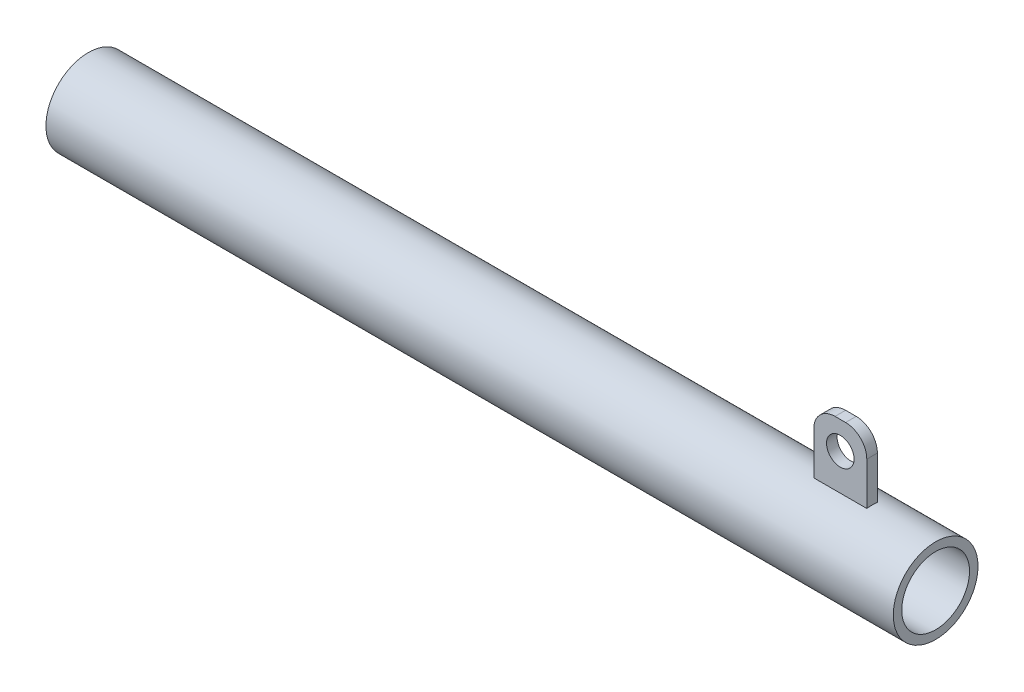
ISO-10303-21;
HEADER;
FILE_DESCRIPTION(('STEP AP214'),'2;1');
FILE_NAME('part.step','',(''),(''),'','','');
FILE_SCHEMA(('AUTOMOTIVE_DESIGN { 1 0 10303 214 1 1 1 1 }'));
ENDSEC;
DATA;
#1=APPLICATION_CONTEXT('core data for automotive mechanical design processes');
#2=APPLICATION_PROTOCOL_DEFINITION('international standard','automotive_design',2000,#1);
#3=PRODUCT_CONTEXT('',#1,'mechanical');
#4=PRODUCT('Part','Part','',(#3));
#5=PRODUCT_RELATED_PRODUCT_CATEGORY('part','',(#4));
#6=PRODUCT_DEFINITION_FORMATION('','',#4);
#7=PRODUCT_DEFINITION_CONTEXT('part definition',#1,'design');
#8=PRODUCT_DEFINITION('design','',#6,#7);
#9=PRODUCT_DEFINITION_SHAPE('','',#8);
#10=(LENGTH_UNIT() NAMED_UNIT(*) SI_UNIT(.MILLI.,.METRE.));
#11=(NAMED_UNIT(*) PLANE_ANGLE_UNIT() SI_UNIT($,.RADIAN.));
#12=(NAMED_UNIT(*) SI_UNIT($,.STERADIAN.) SOLID_ANGLE_UNIT());
#13=UNCERTAINTY_MEASURE_WITH_UNIT(LENGTH_MEASURE(1.E-05),#10,'distance_accuracy_value','');
#14=(GEOMETRIC_REPRESENTATION_CONTEXT(3) GLOBAL_UNCERTAINTY_ASSIGNED_CONTEXT((#13)) GLOBAL_UNIT_ASSIGNED_CONTEXT((#10,
#11,#12)) REPRESENTATION_CONTEXT('',''));
#15=CARTESIAN_POINT('',(0.,0.,0.));
#16=DIRECTION('',(0.,0.,1.));
#17=DIRECTION('',(1.,0.,0.));
#18=AXIS2_PLACEMENT_3D('',#15,#16,#17);
#19=CARTESIAN_POINT('',(-400.,0.,0.));
#20=DIRECTION('',(1.,0.,0.));
#21=DIRECTION('',(0.,0.,-1.));
#22=AXIS2_PLACEMENT_3D('',#19,#20,#21);
#23=CYLINDRICAL_SURFACE('',#22,20.);
#24=DIRECTION('',(1.,0.,0.));
#25=VECTOR('',#24,1.);
#26=CARTESIAN_POINT('',(-400.,19.8431348329844,-2.50000000000006));
#27=LINE('',#26,#25);
#28=CARTESIAN_POINT('',(-55.,19.8431348329844,-2.5));
#29=VERTEX_POINT('',#28);
#30=CARTESIAN_POINT('',(-30.,19.8431348329844,-2.50000000000006));
#31=VERTEX_POINT('',#30);
#32=EDGE_CURVE('E93',#29,#31,#27,.T.);
#33=ORIENTED_EDGE('',*,*,#32,.T.);
#34=CARTESIAN_POINT('',(-30.,0.,0.));
#35=DIRECTION('',(1.,0.,0.));
#36=DIRECTION('',(0.,0.,-1.));
#37=AXIS2_PLACEMENT_3D('',#34,#35,#36);
#38=CIRCLE('',#37,20.);
#39=CARTESIAN_POINT('',(-30.,19.8431348329844,2.49999999999994));
#40=VERTEX_POINT('',#39);
#41=EDGE_CURVE('E87',#31,#40,#38,.T.);
#42=ORIENTED_EDGE('',*,*,#41,.T.);
#43=DIRECTION('',(1.,0.,0.));
#44=VECTOR('',#43,1.);
#45=CARTESIAN_POINT('',(-400.,19.8431348329844,2.49999999999994));
#46=LINE('',#45,#44);
#47=CARTESIAN_POINT('',(-55.,19.8431348329844,2.49999999999994));
#48=VERTEX_POINT('',#47);
#49=EDGE_CURVE('E90',#40,#48,#46,.F.);
#50=ORIENTED_EDGE('',*,*,#49,.T.);
#51=CARTESIAN_POINT('',(-55.,0.,0.));
#52=DIRECTION('',(-1.,0.,0.));
#53=DIRECTION('',(0.,0.,1.));
#54=AXIS2_PLACEMENT_3D('',#51,#52,#53);
#55=CIRCLE('',#54,20.);
#56=EDGE_CURVE('E101',#48,#29,#55,.T.);
#57=ORIENTED_EDGE('',*,*,#56,.T.);
#58=EDGE_LOOP('',(#33,#42,#50,#57));
#59=FACE_BOUND('',#58,.T.);
#60=CARTESIAN_POINT('',(-400.,0.,0.));
#61=DIRECTION('',(1.,0.,0.));
#62=DIRECTION('',(0.,0.,-1.));
#63=AXIS2_PLACEMENT_3D('',#60,#61,#62);
#64=CIRCLE('',#63,20.);
#65=CARTESIAN_POINT('',(-400.,0.,-20.));
#66=VERTEX_POINT('',#65);
#67=EDGE_CURVE('E126',#66,#66,#64,.T.);
#68=ORIENTED_EDGE('',*,*,#67,.T.);
#69=EDGE_LOOP('',(#68));
#70=FACE_BOUND('',#69,.T.);
#71=CARTESIAN_POINT('',(0.,0.,0.));
#72=DIRECTION('',(1.,0.,0.));
#73=DIRECTION('',(0.,0.,-1.));
#74=AXIS2_PLACEMENT_3D('',#71,#72,#73);
#75=CIRCLE('',#74,20.);
#76=CARTESIAN_POINT('',(0.,0.,-20.));
#77=VERTEX_POINT('',#76);
#78=EDGE_CURVE('E123',#77,#77,#75,.T.);
#79=ORIENTED_EDGE('',*,*,#78,.F.);
#80=EDGE_LOOP('',(#79));
#81=FACE_BOUND('',#80,.T.);
#82=ADVANCED_FACE('F33',(#59,#70,#81),#23,.T.);
#83=CARTESIAN_POINT('',(-400.,0.,0.));
#84=DIRECTION('',(1.,0.,0.));
#85=DIRECTION('',(0.,0.,-1.));
#86=AXIS2_PLACEMENT_3D('',#83,#84,#85);
#87=PLANE('',#86);
#88=CARTESIAN_POINT('',(-400.,0.,0.));
#89=DIRECTION('',(1.,0.,0.));
#90=DIRECTION('',(0.,0.,-1.));
#91=AXIS2_PLACEMENT_3D('',#88,#89,#90);
#92=CIRCLE('',#91,16.);
#93=CARTESIAN_POINT('',(-400.,0.,-16.));
#94=VERTEX_POINT('',#93);
#95=EDGE_CURVE('E120',#94,#94,#92,.T.);
#96=ORIENTED_EDGE('',*,*,#95,.T.);
#97=EDGE_LOOP('',(#96));
#98=FACE_BOUND('',#97,.T.);
#99=ORIENTED_EDGE('',*,*,#67,.F.);
#100=EDGE_LOOP('',(#99));
#101=FACE_BOUND('',#100,.T.);
#102=ADVANCED_FACE('F169',(#98,#101),#87,.F.);
#103=CARTESIAN_POINT('',(0.,0.,0.));
#104=DIRECTION('',(1.,0.,0.));
#105=DIRECTION('',(0.,0.,-1.));
#106=AXIS2_PLACEMENT_3D('',#103,#104,#105);
#107=PLANE('',#106);
#108=CARTESIAN_POINT('',(0.,0.,0.));
#109=DIRECTION('',(1.,0.,0.));
#110=DIRECTION('',(0.,0.,-1.));
#111=AXIS2_PLACEMENT_3D('',#108,#109,#110);
#112=CIRCLE('',#111,16.);
#113=CARTESIAN_POINT('',(0.,0.,-16.));
#114=VERTEX_POINT('',#113);
#115=EDGE_CURVE('E118',#114,#114,#112,.T.);
#116=ORIENTED_EDGE('',*,*,#115,.F.);
#117=EDGE_LOOP('',(#116));
#118=FACE_BOUND('',#117,.T.);
#119=ORIENTED_EDGE('',*,*,#78,.T.);
#120=EDGE_LOOP('',(#119));
#121=FACE_BOUND('',#120,.T.);
#122=ADVANCED_FACE('F174',(#118,#121),#107,.T.);
#123=CARTESIAN_POINT('',(-400.,0.,0.));
#124=DIRECTION('',(1.,0.,0.));
#125=DIRECTION('',(0.,0.,-1.));
#126=AXIS2_PLACEMENT_3D('',#123,#124,#125);
#127=CYLINDRICAL_SURFACE('',#126,16.);
#128=ORIENTED_EDGE('',*,*,#95,.F.);
#129=EDGE_LOOP('',(#128));
#130=FACE_BOUND('',#129,.T.);
#131=ORIENTED_EDGE('',*,*,#115,.T.);
#132=EDGE_LOOP('',(#131));
#133=FACE_BOUND('',#132,.T.);
#134=ADVANCED_FACE('F166',(#130,#133),#127,.F.);
#135=CARTESIAN_POINT('',(-30.,-20.001,-2.5));
#136=DIRECTION('',(1.,0.,0.));
#137=DIRECTION('',(0.,0.,-1.));
#138=AXIS2_PLACEMENT_3D('',#135,#136,#137);
#139=PLANE('',#138);
#140=DIRECTION('',(0.,1.,0.));
#141=VECTOR('',#140,1.);
#142=CARTESIAN_POINT('',(-30.,-20.001,-2.5));
#143=LINE('',#142,#141);
#144=CARTESIAN_POINT('',(-30.,40.,-2.5));
#145=VERTEX_POINT('',#144);
#146=EDGE_CURVE('E113',#31,#145,#143,.T.);
#147=ORIENTED_EDGE('',*,*,#146,.T.);
#148=DIRECTION('',(0.,0.,-1.));
#149=VECTOR('',#148,1.);
#150=CARTESIAN_POINT('',(-30.,40.,-2.5));
#151=LINE('',#150,#149);
#152=CARTESIAN_POINT('',(-30.,40.,2.5));
#153=VERTEX_POINT('',#152);
#154=EDGE_CURVE('E56',#145,#153,#151,.F.);
#155=ORIENTED_EDGE('',*,*,#154,.T.);
#156=DIRECTION('',(0.,1.,0.));
#157=VECTOR('',#156,1.);
#158=CARTESIAN_POINT('',(-30.,-20.001,2.5));
#159=LINE('',#158,#157);
#160=EDGE_CURVE('E98',#40,#153,#159,.T.);
#161=ORIENTED_EDGE('',*,*,#160,.F.);
#162=ORIENTED_EDGE('',*,*,#41,.F.);
#163=EDGE_LOOP('',(#147,#155,#161,#162));
#164=FACE_BOUND('',#163,.T.);
#165=ADVANCED_FACE('F103',(#164),#139,.T.);
#166=CARTESIAN_POINT('',(-55.,-20.001,-2.5));
#167=DIRECTION('',(-1.,0.,0.));
#168=DIRECTION('',(0.,0.,1.));
#169=AXIS2_PLACEMENT_3D('',#166,#167,#168);
#170=PLANE('',#169);
#171=DIRECTION('',(0.,1.,0.));
#172=VECTOR('',#171,1.);
#173=CARTESIAN_POINT('',(-55.,-20.001,2.5));
#174=LINE('',#173,#172);
#175=CARTESIAN_POINT('',(-55.,40.,2.5));
#176=VERTEX_POINT('',#175);
#177=EDGE_CURVE('E100',#48,#176,#174,.T.);
#178=ORIENTED_EDGE('',*,*,#177,.T.);
#179=DIRECTION('',(0.,0.,1.));
#180=VECTOR('',#179,1.);
#181=CARTESIAN_POINT('',(-55.,40.,-2.5));
#182=LINE('',#181,#180);
#183=CARTESIAN_POINT('',(-55.,40.,-2.5));
#184=VERTEX_POINT('',#183);
#185=EDGE_CURVE('E11',#176,#184,#182,.F.);
#186=ORIENTED_EDGE('',*,*,#185,.T.);
#187=DIRECTION('',(0.,1.,0.));
#188=VECTOR('',#187,1.);
#189=CARTESIAN_POINT('',(-55.,-20.001,-2.5));
#190=LINE('',#189,#188);
#191=EDGE_CURVE('E105',#29,#184,#190,.T.);
#192=ORIENTED_EDGE('',*,*,#191,.F.);
#193=ORIENTED_EDGE('',*,*,#56,.F.);
#194=EDGE_LOOP('',(#178,#186,#192,#193));
#195=FACE_BOUND('',#194,.T.);
#196=ADVANCED_FACE('F157',(#195),#170,.T.);
#197=CARTESIAN_POINT('',(-55.,-20.001,-2.5));
#198=DIRECTION('',(0.,0.,-1.));
#199=DIRECTION('',(-1.,0.,0.));
#200=AXIS2_PLACEMENT_3D('',#197,#198,#199);
#201=PLANE('',#200);
#202=CARTESIAN_POINT('',(-42.5,37.,-2.5));
#203=DIRECTION('',(0.,0.,-1.));
#204=DIRECTION('',(-1.,0.,0.));
#205=AXIS2_PLACEMENT_3D('',#202,#203,#204);
#206=CIRCLE('',#205,6.5);
#207=CARTESIAN_POINT('',(-49.,37.,-2.5));
#208=VERTEX_POINT('',#207);
#209=EDGE_CURVE('E116',#208,#208,#206,.T.);
#210=ORIENTED_EDGE('',*,*,#209,.F.);
#211=EDGE_LOOP('',(#210));
#212=FACE_BOUND('',#211,.T.);
#213=DIRECTION('',(-1.,0.,0.));
#214=VECTOR('',#213,1.);
#215=CARTESIAN_POINT('',(-55.,50.,-2.5));
#216=LINE('',#215,#214);
#217=CARTESIAN_POINT('',(-40.,50.,-2.5));
#218=VERTEX_POINT('',#217);
#219=CARTESIAN_POINT('',(-45.,50.,-2.5));
#220=VERTEX_POINT('',#219);
#221=EDGE_CURVE('E104',#218,#220,#216,.T.);
#222=ORIENTED_EDGE('',*,*,#221,.F.);
#223=CARTESIAN_POINT('',(-40.,40.,-2.5));
#224=DIRECTION('',(0.,0.,-1.));
#225=DIRECTION('',(-1.,0.,0.));
#226=AXIS2_PLACEMENT_3D('',#223,#224,#225);
#227=CIRCLE('',#226,10.);
#228=EDGE_CURVE('E139',#218,#145,#227,.T.);
#229=ORIENTED_EDGE('',*,*,#228,.T.);
#230=ORIENTED_EDGE('',*,*,#146,.F.);
#231=ORIENTED_EDGE('',*,*,#32,.F.);
#232=ORIENTED_EDGE('',*,*,#191,.T.);
#233=CARTESIAN_POINT('',(-45.,40.,-2.5));
#234=DIRECTION('',(0.,0.,-1.));
#235=DIRECTION('',(-1.,0.,0.));
#236=AXIS2_PLACEMENT_3D('',#233,#234,#235);
#237=CIRCLE('',#236,10.);
#238=EDGE_CURVE('E137',#184,#220,#237,.T.);
#239=ORIENTED_EDGE('',*,*,#238,.T.);
#240=EDGE_LOOP('',(#222,#229,#230,#231,#232,#239));
#241=FACE_BOUND('',#240,.T.);
#242=ADVANCED_FACE('F151',(#212,#241),#201,.T.);
#243=CARTESIAN_POINT('',(-55.,-20.001,2.5));
#244=DIRECTION('',(0.,0.,1.));
#245=DIRECTION('',(1.,0.,0.));
#246=AXIS2_PLACEMENT_3D('',#243,#244,#245);
#247=PLANE('',#246);
#248=CARTESIAN_POINT('',(-42.5,37.,2.50000000000001));
#249=DIRECTION('',(0.,0.,1.));
#250=DIRECTION('',(1.,0.,0.));
#251=AXIS2_PLACEMENT_3D('',#248,#249,#250);
#252=CIRCLE('',#251,6.5);
#253=CARTESIAN_POINT('',(-36.,37.,2.50000000000001));
#254=VERTEX_POINT('',#253);
#255=EDGE_CURVE('E200',#254,#254,#252,.T.);
#256=ORIENTED_EDGE('',*,*,#255,.F.);
#257=EDGE_LOOP('',(#256));
#258=FACE_BOUND('',#257,.T.);
#259=ORIENTED_EDGE('',*,*,#160,.T.);
#260=CARTESIAN_POINT('',(-40.,40.,2.5));
#261=DIRECTION('',(0.,0.,1.));
#262=DIRECTION('',(1.,0.,0.));
#263=AXIS2_PLACEMENT_3D('',#260,#261,#262);
#264=CIRCLE('',#263,10.);
#265=CARTESIAN_POINT('',(-40.,50.,2.5));
#266=VERTEX_POINT('',#265);
#267=EDGE_CURVE('E41',#153,#266,#264,.T.);
#268=ORIENTED_EDGE('',*,*,#267,.T.);
#269=DIRECTION('',(1.,0.,0.));
#270=VECTOR('',#269,1.);
#271=CARTESIAN_POINT('',(-55.,50.,2.5));
#272=LINE('',#271,#270);
#273=CARTESIAN_POINT('',(-45.,50.,2.5));
#274=VERTEX_POINT('',#273);
#275=EDGE_CURVE('E95',#274,#266,#272,.T.);
#276=ORIENTED_EDGE('',*,*,#275,.F.);
#277=CARTESIAN_POINT('',(-45.,40.,2.5));
#278=DIRECTION('',(0.,0.,1.));
#279=DIRECTION('',(1.,0.,0.));
#280=AXIS2_PLACEMENT_3D('',#277,#278,#279);
#281=CIRCLE('',#280,10.);
#282=EDGE_CURVE('E48',#274,#176,#281,.T.);
#283=ORIENTED_EDGE('',*,*,#282,.T.);
#284=ORIENTED_EDGE('',*,*,#177,.F.);
#285=ORIENTED_EDGE('',*,*,#49,.F.);
#286=EDGE_LOOP('',(#259,#268,#276,#283,#284,#285));
#287=FACE_BOUND('',#286,.T.);
#288=ADVANCED_FACE('F97',(#258,#287),#247,.T.);
#289=CARTESIAN_POINT('',(0.,50.,0.));
#290=DIRECTION('',(0.,1.,0.));
#291=DIRECTION('',(0.,0.,1.));
#292=AXIS2_PLACEMENT_3D('',#289,#290,#291);
#293=PLANE('',#292);
#294=ORIENTED_EDGE('',*,*,#275,.T.);
#295=DIRECTION('',(0.,0.,-1.));
#296=VECTOR('',#295,1.);
#297=CARTESIAN_POINT('',(-40.,50.,0.));
#298=LINE('',#297,#296);
#299=EDGE_CURVE('E134',#266,#218,#298,.T.);
#300=ORIENTED_EDGE('',*,*,#299,.T.);
#301=ORIENTED_EDGE('',*,*,#221,.T.);
#302=DIRECTION('',(0.,0.,1.));
#303=VECTOR('',#302,1.);
#304=CARTESIAN_POINT('',(-45.,50.,0.));
#305=LINE('',#304,#303);
#306=EDGE_CURVE('E129',#220,#274,#305,.T.);
#307=ORIENTED_EDGE('',*,*,#306,.T.);
#308=EDGE_LOOP('',(#294,#300,#301,#307));
#309=FACE_BOUND('',#308,.T.);
#310=ADVANCED_FACE('F146',(#309),#293,.T.);
#311=CARTESIAN_POINT('',(-40.,40.,0.));
#312=DIRECTION('',(0.,0.,-1.));
#313=DIRECTION('',(-1.,0.,0.));
#314=AXIS2_PLACEMENT_3D('',#311,#312,#313);
#315=CYLINDRICAL_SURFACE('',#314,10.);
#316=ORIENTED_EDGE('',*,*,#267,.F.);
#317=ORIENTED_EDGE('',*,*,#154,.F.);
#318=ORIENTED_EDGE('',*,*,#228,.F.);
#319=ORIENTED_EDGE('',*,*,#299,.F.);
#320=EDGE_LOOP('',(#316,#317,#318,#319));
#321=FACE_BOUND('',#320,.T.);
#322=ADVANCED_FACE('F149',(#321),#315,.T.);
#323=CARTESIAN_POINT('',(-45.,40.,0.));
#324=DIRECTION('',(0.,0.,1.));
#325=DIRECTION('',(1.,0.,0.));
#326=AXIS2_PLACEMENT_3D('',#323,#324,#325);
#327=CYLINDRICAL_SURFACE('',#326,10.);
#328=ORIENTED_EDGE('',*,*,#238,.F.);
#329=ORIENTED_EDGE('',*,*,#185,.F.);
#330=ORIENTED_EDGE('',*,*,#282,.F.);
#331=ORIENTED_EDGE('',*,*,#306,.F.);
#332=EDGE_LOOP('',(#328,#329,#330,#331));
#333=FACE_BOUND('',#332,.T.);
#334=ADVANCED_FACE('F35',(#333),#327,.T.);
#335=CARTESIAN_POINT('',(-42.5,37.,-7.49999999999999));
#336=DIRECTION('',(0.,0.,1.));
#337=DIRECTION('',(1.,0.,0.));
#338=AXIS2_PLACEMENT_3D('',#335,#336,#337);
#339=CYLINDRICAL_SURFACE('',#338,6.5);
#340=ORIENTED_EDGE('',*,*,#209,.T.);
#341=EDGE_LOOP('',(#340));
#342=FACE_BOUND('',#341,.T.);
#343=ORIENTED_EDGE('',*,*,#255,.T.);
#344=EDGE_LOOP('',(#343));
#345=FACE_BOUND('',#344,.T.);
#346=ADVANCED_FACE('F183',(#342,#345),#339,.F.);
#347=CLOSED_SHELL('',(#82,#102,#122,#134,#165,#196,#242,#288,#310,#322,#334,#346));
#348=MANIFOLD_SOLID_BREP('B2',#347);
#349=ADVANCED_BREP_SHAPE_REPRESENTATION('',(#18,#348),#14);
#350=SHAPE_DEFINITION_REPRESENTATION(#9,#349);
ENDSEC;
END-ISO-10303-21;
